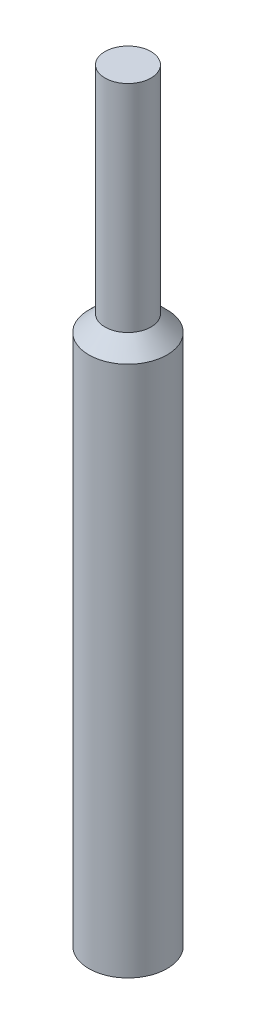
ISO-10303-21;
HEADER;
FILE_DESCRIPTION(('STEP AP214'),'2;1');
FILE_NAME('part.step','',(''),(''),'','','');
FILE_SCHEMA(('AUTOMOTIVE_DESIGN { 1 0 10303 214 1 1 1 1 }'));
ENDSEC;
DATA;
#1=APPLICATION_CONTEXT('core data for automotive mechanical design processes');
#2=APPLICATION_PROTOCOL_DEFINITION('international standard','automotive_design',2000,#1);
#3=PRODUCT_CONTEXT('',#1,'mechanical');
#4=PRODUCT('Part','Part','',(#3));
#5=PRODUCT_RELATED_PRODUCT_CATEGORY('part','',(#4));
#6=PRODUCT_DEFINITION_FORMATION('','',#4);
#7=PRODUCT_DEFINITION_CONTEXT('part definition',#1,'design');
#8=PRODUCT_DEFINITION('design','',#6,#7);
#9=PRODUCT_DEFINITION_SHAPE('','',#8);
#10=(LENGTH_UNIT() NAMED_UNIT(*) SI_UNIT(.MILLI.,.METRE.));
#11=(NAMED_UNIT(*) PLANE_ANGLE_UNIT() SI_UNIT($,.RADIAN.));
#12=(NAMED_UNIT(*) SI_UNIT($,.STERADIAN.) SOLID_ANGLE_UNIT());
#13=UNCERTAINTY_MEASURE_WITH_UNIT(LENGTH_MEASURE(1.E-05),#10,'distance_accuracy_value','');
#14=(GEOMETRIC_REPRESENTATION_CONTEXT(3) GLOBAL_UNCERTAINTY_ASSIGNED_CONTEXT((#13)) GLOBAL_UNIT_ASSIGNED_CONTEXT((#10,
#11,#12)) REPRESENTATION_CONTEXT('',''));
#15=CARTESIAN_POINT('',(0.,0.,0.));
#16=DIRECTION('',(0.,0.,1.));
#17=DIRECTION('',(1.,0.,0.));
#18=AXIS2_PLACEMENT_3D('',#15,#16,#17);
#19=CARTESIAN_POINT('',(0.,421.64,0.));
#20=DIRECTION('',(0.,-1.,0.));
#21=DIRECTION('',(0.,0.,-1.));
#22=AXIS2_PLACEMENT_3D('',#19,#20,#21);
#23=CYLINDRICAL_SURFACE('',#22,10.795);
#24=CARTESIAN_POINT('',(0.,210.82,0.));
#25=DIRECTION('',(0.,1.,0.));
#26=DIRECTION('',(0.,0.,1.));
#27=AXIS2_PLACEMENT_3D('',#24,#25,#26);
#28=CIRCLE('',#27,10.795);
#29=CARTESIAN_POINT('',(0.,210.82,10.795));
#30=VERTEX_POINT('',#29);
#31=EDGE_CURVE('E37',#30,#30,#28,.F.);
#32=ORIENTED_EDGE('',*,*,#31,.F.);
#33=EDGE_LOOP('',(#32));
#34=FACE_BOUND('',#33,.T.);
#35=CARTESIAN_POINT('',(0.,357.632,0.));
#36=DIRECTION('',(0.,1.,0.));
#37=DIRECTION('',(0.,0.,1.));
#38=AXIS2_PLACEMENT_3D('',#35,#36,#37);
#39=CIRCLE('',#38,10.795);
#40=CARTESIAN_POINT('',(0.,357.632,10.795));
#41=VERTEX_POINT('',#40);
#42=EDGE_CURVE('E42',#41,#41,#39,.F.);
#43=ORIENTED_EDGE('',*,*,#42,.T.);
#44=EDGE_LOOP('',(#43));
#45=FACE_BOUND('',#44,.T.);
#46=ADVANCED_FACE('F33',(#34,#45),#23,.T.);
#47=CARTESIAN_POINT('',(0.,363.982,0.));
#48=DIRECTION('',(0.,1.,0.));
#49=DIRECTION('',(0.,0.,1.));
#50=AXIS2_PLACEMENT_3D('',#47,#48,#49);
#51=CYLINDRICAL_SURFACE('',#50,6.35);
#52=CARTESIAN_POINT('',(0.,362.077,0.));
#53=DIRECTION('',(0.,-1.,0.));
#54=DIRECTION('',(0.,0.,-1.));
#55=AXIS2_PLACEMENT_3D('',#52,#53,#54);
#56=CIRCLE('',#55,6.35);
#57=CARTESIAN_POINT('',(0.,362.077,6.35));
#58=VERTEX_POINT('',#57);
#59=EDGE_CURVE('E11',#58,#58,#56,.F.);
#60=CARTESIAN_POINT('',(0.,421.64,0.));
#61=DIRECTION('',(0.,1.,0.));
#62=DIRECTION('',(0.,0.,1.));
#63=AXIS2_PLACEMENT_3D('',#60,#61,#62);
#64=CIRCLE('',#63,6.35);
#65=CARTESIAN_POINT('',(0.,421.64,6.35));
#66=VERTEX_POINT('',#65);
#67=EDGE_CURVE('E141',#66,#66,#64,.T.);
#68=CARTESIAN_POINT('',(0.,362.077,6.35));
#69=CARTESIAN_POINT('',(0.,362.697447916667,6.35));
#70=CARTESIAN_POINT('',(0.,363.317895833333,6.35));
#71=CARTESIAN_POINT('',(0.,364.558791666667,6.35));
#72=CARTESIAN_POINT('',(0.,365.179239583333,6.35));
#73=CARTESIAN_POINT('',(0.,366.420135416667,6.35));
#74=CARTESIAN_POINT('',(0.,367.040583333333,6.35));
#75=CARTESIAN_POINT('',(0.,368.281479166667,6.35));
#76=CARTESIAN_POINT('',(0.,368.901927083333,6.35));
#77=CARTESIAN_POINT('',(0.,370.142822916667,6.35));
#78=CARTESIAN_POINT('',(0.,370.763270833333,6.35));
#79=CARTESIAN_POINT('',(0.,372.004166666667,6.35));
#80=CARTESIAN_POINT('',(0.,372.624614583333,6.35));
#81=CARTESIAN_POINT('',(0.,373.865510416667,6.35));
#82=CARTESIAN_POINT('',(0.,374.485958333333,6.35));
#83=CARTESIAN_POINT('',(0.,375.726854166667,6.35));
#84=CARTESIAN_POINT('',(0.,376.347302083333,6.35));
#85=CARTESIAN_POINT('',(0.,377.588197916667,6.35));
#86=CARTESIAN_POINT('',(0.,378.208645833333,6.35));
#87=CARTESIAN_POINT('',(0.,379.449541666667,6.35));
#88=CARTESIAN_POINT('',(0.,380.069989583333,6.35));
#89=CARTESIAN_POINT('',(0.,381.310885416667,6.35));
#90=CARTESIAN_POINT('',(0.,381.931333333333,6.35));
#91=CARTESIAN_POINT('',(0.,383.172229166667,6.35));
#92=CARTESIAN_POINT('',(0.,383.792677083333,6.35));
#93=CARTESIAN_POINT('',(0.,385.033572916667,6.35));
#94=CARTESIAN_POINT('',(0.,385.654020833333,6.35));
#95=CARTESIAN_POINT('',(0.,386.894916666667,6.35));
#96=CARTESIAN_POINT('',(0.,387.515364583333,6.35));
#97=CARTESIAN_POINT('',(0.,388.756260416667,6.35));
#98=CARTESIAN_POINT('',(0.,389.376708333333,6.35));
#99=CARTESIAN_POINT('',(0.,390.617604166667,6.35));
#100=CARTESIAN_POINT('',(0.,391.238052083333,6.35));
#101=CARTESIAN_POINT('',(0.,392.478947916667,6.35));
#102=CARTESIAN_POINT('',(0.,393.099395833333,6.35));
#103=CARTESIAN_POINT('',(0.,394.340291666667,6.35));
#104=CARTESIAN_POINT('',(0.,394.960739583333,6.35));
#105=CARTESIAN_POINT('',(0.,396.201635416667,6.35));
#106=CARTESIAN_POINT('',(0.,396.822083333333,6.35));
#107=CARTESIAN_POINT('',(0.,398.062979166667,6.35));
#108=CARTESIAN_POINT('',(0.,398.683427083333,6.35));
#109=CARTESIAN_POINT('',(0.,399.924322916667,6.35));
#110=CARTESIAN_POINT('',(0.,400.544770833333,6.35));
#111=CARTESIAN_POINT('',(0.,401.785666666667,6.35));
#112=CARTESIAN_POINT('',(0.,402.406114583333,6.35));
#113=CARTESIAN_POINT('',(0.,403.647010416667,6.35));
#114=CARTESIAN_POINT('',(0.,404.267458333333,6.35));
#115=CARTESIAN_POINT('',(0.,405.508354166667,6.35));
#116=CARTESIAN_POINT('',(0.,406.128802083333,6.35));
#117=CARTESIAN_POINT('',(0.,407.369697916667,6.35));
#118=CARTESIAN_POINT('',(0.,407.990145833333,6.35));
#119=CARTESIAN_POINT('',(0.,409.231041666667,6.35));
#120=CARTESIAN_POINT('',(0.,409.851489583333,6.35));
#121=CARTESIAN_POINT('',(0.,411.092385416667,6.35));
#122=CARTESIAN_POINT('',(0.,411.712833333333,6.35));
#123=CARTESIAN_POINT('',(0.,412.953729166667,6.35));
#124=CARTESIAN_POINT('',(0.,413.574177083333,6.35));
#125=CARTESIAN_POINT('',(0.,414.815072916667,6.35));
#126=CARTESIAN_POINT('',(0.,415.435520833333,6.35));
#127=CARTESIAN_POINT('',(0.,416.676416666667,6.35));
#128=CARTESIAN_POINT('',(0.,417.296864583333,6.35));
#129=CARTESIAN_POINT('',(0.,418.537760416667,6.35));
#130=CARTESIAN_POINT('',(0.,419.158208333333,6.35));
#131=CARTESIAN_POINT('',(0.,420.399104166667,6.35));
#132=CARTESIAN_POINT('',(0.,421.019552083333,6.35));
#133=CARTESIAN_POINT('',(0.,421.64,6.35));
#134=B_SPLINE_CURVE_WITH_KNOTS('',3,(#68,#69,#70,#71,#72,#73,#74,#75,#76,#77,#78,#79,#80,#81,
#82,#83,#84,#85,#86,#87,#88,#89,#90,#91,#92,#93,#94,#95,#96,#97,#98,#99,#100,#101,#102,#103,
#104,#105,#106,#107,#108,#109,#110,#111,#112,#113,#114,#115,#116,#117,#118,#119,#120,#121,#122,
#123,#124,#125,#126,#127,#128,#129,#130,#131,#132,#133),.UNSPECIFIED.,.F.,.F.,(4,2,2,2,2,2,2,2,
2,2,2,2,2,2,2,2,2,2,2,2,2,2,2,2,2,2,2,2,2,2,2,2,4),(0.,1.86134374999997,3.72268749999999,
5.58403124999995,7.44537499999998,9.30671874999994,11.1680625,13.02940625,14.89075,16.75209375,
18.6134374999999,20.47478125,22.336125,24.1974687499999,26.0588125,27.9201562499999,29.7815,
31.64284375,33.5041875,35.36553125,37.2268749999999,39.08821875,40.9495624999999,
42.8109062499999,44.67225,46.5335937499999,48.3949375,50.2562812499999,52.1176249999999,
53.97896875,55.8403124999999,57.70165625,59.5629999999999),.UNSPECIFIED.);
#135=EDGE_CURVE('BSEAM159',#58,#66,#134,.T.);
#136=ORIENTED_EDGE('',*,*,#59,.T.);
#137=ORIENTED_EDGE('',*,*,#67,.F.);
#138=ORIENTED_EDGE('',*,*,#135,.T.);
#139=ORIENTED_EDGE('',*,*,#135,.F.);
#140=EDGE_LOOP('',(#136,#138,#137,#139));
#141=FACE_BOUND('',#140,.T.);
#142=ADVANCED_FACE('F159',(#141),#51,.T.);
#143=CARTESIAN_POINT('',(0.,421.64,0.));
#144=DIRECTION('',(0.,1.,0.));
#145=DIRECTION('',(0.,0.,1.));
#146=AXIS2_PLACEMENT_3D('',#143,#144,#145);
#147=PLANE('',#146);
#148=ORIENTED_EDGE('',*,*,#67,.T.);
#149=EDGE_LOOP('',(#148));
#150=FACE_BOUND('',#149,.T.);
#151=ADVANCED_FACE('F150',(#150),#147,.T.);
#152=CARTESIAN_POINT('',(0.,357.632,0.));
#153=DIRECTION('',(0.,-1.,0.));
#154=DIRECTION('',(0.,0.,-1.));
#155=AXIS2_PLACEMENT_3D('',#152,#153,#154);
#156=CONICAL_SURFACE('',#155,10.795,0.785398163397441);
#157=ORIENTED_EDGE('',*,*,#59,.F.);
#158=EDGE_LOOP('',(#157));
#159=FACE_BOUND('',#158,.T.);
#160=ORIENTED_EDGE('',*,*,#42,.F.);
#161=EDGE_LOOP('',(#160));
#162=FACE_BOUND('',#161,.T.);
#163=ADVANCED_FACE('F35',(#159,#162),#156,.T.);
#164=CARTESIAN_POINT('',(0.,210.82,0.));
#165=DIRECTION('',(0.,1.,0.));
#166=DIRECTION('',(0.,0.,1.));
#167=AXIS2_PLACEMENT_3D('',#164,#165,#166);
#168=PLANE('',#167);
#169=DIRECTION('',(-0.889299341806116,0.,0.457325574031464));
#170=VECTOR('',#169,1.);
#171=CARTESIAN_POINT('',(5.05476183926848,210.82,3.25574078845482));
#172=LINE('',#171,#170);
#173=CARTESIAN_POINT('',(5.05476183926848,210.82,3.25574078845482));
#174=VERTEX_POINT('',#173);
#175=CARTESIAN_POINT('',(-0.292173311304815,210.82,6.00542255711407));
#176=VERTEX_POINT('',#175);
#177=EDGE_CURVE('E123',#174,#176,#172,.T.);
#178=ORIENTED_EDGE('',*,*,#177,.F.);
#179=DIRECTION('',(-0.0485941059915095,0.,0.99881860858861));
#180=VECTOR('',#179,1.);
#181=CARTESIAN_POINT('',(5.34693515057329,210.82,-2.74968176865924));
#182=LINE('',#181,#180);
#183=CARTESIAN_POINT('',(5.34693515057329,210.82,-2.74968176865924));
#184=VERTEX_POINT('',#183);
#185=EDGE_CURVE('E49',#184,#174,#182,.T.);
#186=ORIENTED_EDGE('',*,*,#185,.F.);
#187=DIRECTION('',(0.840705235814607,0.,0.541493034557146));
#188=VECTOR('',#187,1.);
#189=CARTESIAN_POINT('',(0.292173311304816,210.82,-6.00542255711407));
#190=LINE('',#189,#188);
#191=CARTESIAN_POINT('',(0.292173311304816,210.82,-6.00542255711407));
#192=VERTEX_POINT('',#191);
#193=EDGE_CURVE('E132',#192,#184,#190,.T.);
#194=ORIENTED_EDGE('',*,*,#193,.F.);
#195=DIRECTION('',(0.889299341806117,0.,-0.457325574031464));
#196=VECTOR('',#195,1.);
#197=CARTESIAN_POINT('',(-5.05476183926848,210.82,-3.25574078845483));
#198=LINE('',#197,#196);
#199=CARTESIAN_POINT('',(-5.05476183926848,210.82,-3.25574078845483));
#200=VERTEX_POINT('',#199);
#201=EDGE_CURVE('E130',#200,#192,#198,.T.);
#202=ORIENTED_EDGE('',*,*,#201,.F.);
#203=DIRECTION('',(0.0485941059915096,0.,-0.99881860858861));
#204=VECTOR('',#203,1.);
#205=CARTESIAN_POINT('',(-5.34693515057329,210.82,2.74968176865924));
#206=LINE('',#205,#204);
#207=CARTESIAN_POINT('',(-5.34693515057329,210.82,2.74968176865924));
#208=VERTEX_POINT('',#207);
#209=EDGE_CURVE('E97',#208,#200,#206,.T.);
#210=ORIENTED_EDGE('',*,*,#209,.F.);
#211=DIRECTION('',(-0.840705235814607,0.,-0.541493034557146));
#212=VECTOR('',#211,1.);
#213=CARTESIAN_POINT('',(-0.292173311304815,210.82,6.00542255711407));
#214=LINE('',#213,#212);
#215=EDGE_CURVE('E126',#176,#208,#214,.T.);
#216=ORIENTED_EDGE('',*,*,#215,.F.);
#217=EDGE_LOOP('',(#178,#186,#194,#202,#210,#216));
#218=FACE_BOUND('',#217,.T.);
#219=ORIENTED_EDGE('',*,*,#31,.T.);
#220=EDGE_LOOP('',(#219));
#221=FACE_BOUND('',#220,.T.);
#222=ADVANCED_FACE('F149',(#218,#221),#168,.F.);
#223=CARTESIAN_POINT('',(5.34693515057329,230.124,-2.74968176865924));
#224=DIRECTION('',(0.998818608588609,0.,0.0485941059915095));
#225=DIRECTION('',(0.0485941059915095,0.,-0.998818608588609));
#226=AXIS2_PLACEMENT_3D('',#223,#224,#225);
#227=PLANE('',#226);
#228=ORIENTED_EDGE('',*,*,#185,.T.);
#229=DIRECTION('',(0.,-1.,0.));
#230=VECTOR('',#229,1.);
#231=CARTESIAN_POINT('',(5.05476183926848,230.124,3.25574078845482));
#232=LINE('',#231,#230);
#233=CARTESIAN_POINT('',(5.05476183926848,230.124,3.25574078845482));
#234=VERTEX_POINT('',#233);
#235=EDGE_CURVE('E79',#234,#174,#232,.T.);
#236=ORIENTED_EDGE('',*,*,#235,.F.);
#237=DIRECTION('',(-0.0485941059915095,0.,0.99881860858861));
#238=VECTOR('',#237,1.);
#239=CARTESIAN_POINT('',(5.34693515057329,230.124,-2.74968176865924));
#240=LINE('',#239,#238);
#241=CARTESIAN_POINT('',(5.34693515057329,230.124,-2.74968176865924));
#242=VERTEX_POINT('',#241);
#243=EDGE_CURVE('E134',#242,#234,#240,.T.);
#244=ORIENTED_EDGE('',*,*,#243,.F.);
#245=DIRECTION('',(0.,-1.,0.));
#246=VECTOR('',#245,1.);
#247=CARTESIAN_POINT('',(5.34693515057329,230.124,-2.74968176865924));
#248=LINE('',#247,#246);
#249=EDGE_CURVE('E57',#242,#184,#248,.T.);
#250=ORIENTED_EDGE('',*,*,#249,.T.);
#251=EDGE_LOOP('',(#228,#236,#244,#250));
#252=FACE_BOUND('',#251,.T.);
#253=ADVANCED_FACE('F156',(#252),#227,.F.);
#254=CARTESIAN_POINT('',(0.292173311304816,230.124,-6.00542255711407));
#255=DIRECTION('',(0.541493034557146,0.,-0.840705235814607));
#256=DIRECTION('',(-0.840705235814607,0.,-0.541493034557146));
#257=AXIS2_PLACEMENT_3D('',#254,#255,#256);
#258=PLANE('',#257);
#259=ORIENTED_EDGE('',*,*,#193,.T.);
#260=ORIENTED_EDGE('',*,*,#249,.F.);
#261=DIRECTION('',(0.840705235814607,0.,0.541493034557146));
#262=VECTOR('',#261,1.);
#263=CARTESIAN_POINT('',(0.292173311304816,230.124,-6.00542255711407));
#264=LINE('',#263,#262);
#265=CARTESIAN_POINT('',(0.292173311304816,230.124,-6.00542255711407));
#266=VERTEX_POINT('',#265);
#267=EDGE_CURVE('E109',#266,#242,#264,.T.);
#268=ORIENTED_EDGE('',*,*,#267,.F.);
#269=DIRECTION('',(0.,-1.,0.));
#270=VECTOR('',#269,1.);
#271=CARTESIAN_POINT('',(0.292173311304816,230.124,-6.00542255711407));
#272=LINE('',#271,#270);
#273=EDGE_CURVE('E101',#266,#192,#272,.T.);
#274=ORIENTED_EDGE('',*,*,#273,.T.);
#275=EDGE_LOOP('',(#259,#260,#268,#274));
#276=FACE_BOUND('',#275,.T.);
#277=ADVANCED_FACE('F174',(#276),#258,.F.);
#278=CARTESIAN_POINT('',(-5.05476183926848,230.124,-3.25574078845483));
#279=DIRECTION('',(-0.457325574031464,0.,-0.889299341806117));
#280=DIRECTION('',(-0.889299341806117,0.,0.457325574031464));
#281=AXIS2_PLACEMENT_3D('',#278,#279,#280);
#282=PLANE('',#281);
#283=ORIENTED_EDGE('',*,*,#201,.T.);
#284=ORIENTED_EDGE('',*,*,#273,.F.);
#285=DIRECTION('',(0.889299341806117,0.,-0.457325574031464));
#286=VECTOR('',#285,1.);
#287=CARTESIAN_POINT('',(-5.05476183926848,230.124,-3.25574078845483));
#288=LINE('',#287,#286);
#289=CARTESIAN_POINT('',(-5.05476183926848,230.124,-3.25574078845483));
#290=VERTEX_POINT('',#289);
#291=EDGE_CURVE('E105',#290,#266,#288,.T.);
#292=ORIENTED_EDGE('',*,*,#291,.F.);
#293=DIRECTION('',(0.,-1.,0.));
#294=VECTOR('',#293,1.);
#295=CARTESIAN_POINT('',(-5.05476183926848,230.124,-3.25574078845483));
#296=LINE('',#295,#294);
#297=EDGE_CURVE('E90',#290,#200,#296,.T.);
#298=ORIENTED_EDGE('',*,*,#297,.T.);
#299=EDGE_LOOP('',(#283,#284,#292,#298));
#300=FACE_BOUND('',#299,.T.);
#301=ADVANCED_FACE('F106',(#300),#282,.F.);
#302=CARTESIAN_POINT('',(-5.34693515057329,230.124,2.74968176865924));
#303=DIRECTION('',(-0.998818608588609,0.,-0.0485941059915096));
#304=DIRECTION('',(-0.0485941059915096,0.,0.998818608588609));
#305=AXIS2_PLACEMENT_3D('',#302,#303,#304);
#306=PLANE('',#305);
#307=ORIENTED_EDGE('',*,*,#209,.T.);
#308=ORIENTED_EDGE('',*,*,#297,.F.);
#309=DIRECTION('',(0.0485941059915096,0.,-0.99881860858861));
#310=VECTOR('',#309,1.);
#311=CARTESIAN_POINT('',(-5.34693515057329,230.124,2.74968176865924));
#312=LINE('',#311,#310);
#313=CARTESIAN_POINT('',(-5.34693515057329,230.124,2.74968176865924));
#314=VERTEX_POINT('',#313);
#315=EDGE_CURVE('E94',#314,#290,#312,.T.);
#316=ORIENTED_EDGE('',*,*,#315,.F.);
#317=DIRECTION('',(0.,-1.,0.));
#318=VECTOR('',#317,1.);
#319=CARTESIAN_POINT('',(-5.34693515057329,230.124,2.74968176865924));
#320=LINE('',#319,#318);
#321=EDGE_CURVE('E102',#314,#208,#320,.T.);
#322=ORIENTED_EDGE('',*,*,#321,.T.);
#323=EDGE_LOOP('',(#307,#308,#316,#322));
#324=FACE_BOUND('',#323,.T.);
#325=ADVANCED_FACE('F92',(#324),#306,.F.);
#326=CARTESIAN_POINT('',(-0.292173311304815,230.124,6.00542255711407));
#327=DIRECTION('',(-0.541493034557146,0.,0.840705235814607));
#328=DIRECTION('',(0.840705235814607,0.,0.541493034557146));
#329=AXIS2_PLACEMENT_3D('',#326,#327,#328);
#330=PLANE('',#329);
#331=ORIENTED_EDGE('',*,*,#215,.T.);
#332=ORIENTED_EDGE('',*,*,#321,.F.);
#333=DIRECTION('',(-0.840705235814607,0.,-0.541493034557146));
#334=VECTOR('',#333,1.);
#335=CARTESIAN_POINT('',(-0.292173311304815,230.124,6.00542255711407));
#336=LINE('',#335,#334);
#337=CARTESIAN_POINT('',(-0.292173311304815,230.124,6.00542255711407));
#338=VERTEX_POINT('',#337);
#339=EDGE_CURVE('E115',#338,#314,#336,.T.);
#340=ORIENTED_EDGE('',*,*,#339,.F.);
#341=DIRECTION('',(0.,-1.,0.));
#342=VECTOR('',#341,1.);
#343=CARTESIAN_POINT('',(-0.292173311304815,230.124,6.00542255711407));
#344=LINE('',#343,#342);
#345=EDGE_CURVE('E138',#338,#176,#344,.T.);
#346=ORIENTED_EDGE('',*,*,#345,.T.);
#347=EDGE_LOOP('',(#331,#332,#340,#346));
#348=FACE_BOUND('',#347,.T.);
#349=ADVANCED_FACE('F178',(#348),#330,.F.);
#350=CARTESIAN_POINT('',(5.05476183926848,230.124,3.25574078845482));
#351=DIRECTION('',(0.457325574031464,0.,0.889299341806116));
#352=DIRECTION('',(0.889299341806116,0.,-0.457325574031464));
#353=AXIS2_PLACEMENT_3D('',#350,#351,#352);
#354=PLANE('',#353);
#355=ORIENTED_EDGE('',*,*,#177,.T.);
#356=ORIENTED_EDGE('',*,*,#345,.F.);
#357=DIRECTION('',(-0.889299341806116,0.,0.457325574031464));
#358=VECTOR('',#357,1.);
#359=CARTESIAN_POINT('',(5.05476183926848,230.124,3.25574078845482));
#360=LINE('',#359,#358);
#361=EDGE_CURVE('E117',#234,#338,#360,.T.);
#362=ORIENTED_EDGE('',*,*,#361,.F.);
#363=ORIENTED_EDGE('',*,*,#235,.T.);
#364=EDGE_LOOP('',(#355,#356,#362,#363));
#365=FACE_BOUND('',#364,.T.);
#366=ADVANCED_FACE('F175',(#365),#354,.F.);
#367=CARTESIAN_POINT('',(0.,230.124,0.));
#368=DIRECTION('',(0.,-1.,0.));
#369=DIRECTION('',(0.,0.,-1.));
#370=AXIS2_PLACEMENT_3D('',#367,#368,#369);
#371=PLANE('',#370);
#372=ORIENTED_EDGE('',*,*,#243,.T.);
#373=ORIENTED_EDGE('',*,*,#361,.T.);
#374=ORIENTED_EDGE('',*,*,#339,.T.);
#375=ORIENTED_EDGE('',*,*,#315,.T.);
#376=ORIENTED_EDGE('',*,*,#291,.T.);
#377=ORIENTED_EDGE('',*,*,#267,.T.);
#378=EDGE_LOOP('',(#372,#373,#374,#375,#376,#377));
#379=FACE_BOUND('',#378,.T.);
#380=ADVANCED_FACE('F112',(#379),#371,.T.);
#381=CLOSED_SHELL('',(#46,#142,#151,#163,#222,#253,#277,#301,#325,#349,#366,#380));
#382=MANIFOLD_SOLID_BREP('B2',#381);
#383=ADVANCED_BREP_SHAPE_REPRESENTATION('',(#18,#382),#14);
#384=SHAPE_DEFINITION_REPRESENTATION(#9,#383);
ENDSEC;
END-ISO-10303-21;
